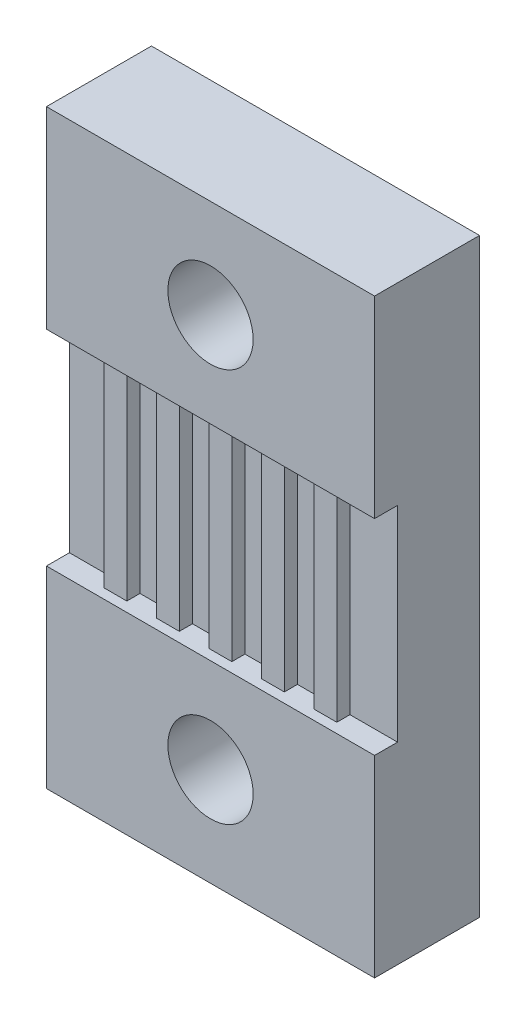
ISO-10303-21;
HEADER;
FILE_DESCRIPTION(('STEP AP214'),'2;1');
FILE_NAME('part.step','',(''),(''),'','','');
FILE_SCHEMA(('AUTOMOTIVE_DESIGN { 1 0 10303 214 1 1 1 1 }'));
ENDSEC;
DATA;
#1=APPLICATION_CONTEXT('core data for automotive mechanical design processes');
#2=APPLICATION_PROTOCOL_DEFINITION('international standard','automotive_design',2000,#1);
#3=PRODUCT_CONTEXT('',#1,'mechanical');
#4=PRODUCT('Part','Part','',(#3));
#5=PRODUCT_RELATED_PRODUCT_CATEGORY('part','',(#4));
#6=PRODUCT_DEFINITION_FORMATION('','',#4);
#7=PRODUCT_DEFINITION_CONTEXT('part definition',#1,'design');
#8=PRODUCT_DEFINITION('design','',#6,#7);
#9=PRODUCT_DEFINITION_SHAPE('','',#8);
#10=(LENGTH_UNIT() NAMED_UNIT(*) SI_UNIT(.MILLI.,.METRE.));
#11=(NAMED_UNIT(*) PLANE_ANGLE_UNIT() SI_UNIT($,.RADIAN.));
#12=(NAMED_UNIT(*) SI_UNIT($,.STERADIAN.) SOLID_ANGLE_UNIT());
#13=UNCERTAINTY_MEASURE_WITH_UNIT(LENGTH_MEASURE(1.E-05),#10,'distance_accuracy_value','');
#14=(GEOMETRIC_REPRESENTATION_CONTEXT(3) GLOBAL_UNCERTAINTY_ASSIGNED_CONTEXT((#13)) GLOBAL_UNIT_ASSIGNED_CONTEXT((#10,
#11,#12)) REPRESENTATION_CONTEXT('',''));
#15=CARTESIAN_POINT('',(0.,0.,0.));
#16=DIRECTION('',(0.,0.,1.));
#17=DIRECTION('',(1.,0.,0.));
#18=AXIS2_PLACEMENT_3D('',#15,#16,#17);
#19=CARTESIAN_POINT('',(0.,0.,3.175));
#20=DIRECTION('',(0.,0.,-1.));
#21=DIRECTION('',(-1.,0.,0.));
#22=AXIS2_PLACEMENT_3D('',#19,#20,#21);
#23=PLANE('',#22);
#24=DIRECTION('',(0.,1.,0.));
#25=VECTOR('',#24,1.);
#26=CARTESIAN_POINT('',(-4.5085,-11.432,3.175));
#27=LINE('',#26,#25);
#28=CARTESIAN_POINT('',(-4.5085,-3.96875,3.175));
#29=VERTEX_POINT('',#28);
#30=CARTESIAN_POINT('',(-4.5085,3.96875,3.175));
#31=VERTEX_POINT('',#30);
#32=EDGE_CURVE('E246',#29,#31,#27,.T.);
#33=ORIENTED_EDGE('',*,*,#32,.T.);
#34=DIRECTION('',(1.,0.,0.));
#35=VECTOR('',#34,1.);
#36=CARTESIAN_POINT('',(-6.35,3.96875,3.175));
#37=LINE('',#36,#35);
#38=CARTESIAN_POINT('',(-6.35,3.96875,3.175));
#39=VERTEX_POINT('',#38);
#40=EDGE_CURVE('E234',#39,#31,#37,.T.);
#41=ORIENTED_EDGE('',*,*,#40,.F.);
#42=DIRECTION('',(0.,-1.,0.));
#43=VECTOR('',#42,1.);
#44=CARTESIAN_POINT('',(-6.35,-11.43,3.175));
#45=LINE('',#44,#43);
#46=CARTESIAN_POINT('',(-6.35,-3.96875,3.175));
#47=VERTEX_POINT('',#46);
#48=EDGE_CURVE('E427',#39,#47,#45,.T.);
#49=ORIENTED_EDGE('',*,*,#48,.T.);
#50=DIRECTION('',(-1.,0.,0.));
#51=VECTOR('',#50,1.);
#52=CARTESIAN_POINT('',(-6.35,-3.96875,3.175));
#53=LINE('',#52,#51);
#54=EDGE_CURVE('E415',#29,#47,#53,.T.);
#55=ORIENTED_EDGE('',*,*,#54,.F.);
#56=EDGE_LOOP('',(#33,#41,#49,#55));
#57=FACE_BOUND('',#56,.T.);
#58=ADVANCED_FACE('F43',(#57),#23,.F.);
#59=DIRECTION('',(0.,1.,0.));
#60=VECTOR('',#59,1.);
#61=CARTESIAN_POINT('',(-3.6195,-11.432,3.175));
#62=LINE('',#61,#60);
#63=CARTESIAN_POINT('',(-3.6195,-3.96875,3.175));
#64=VERTEX_POINT('',#63);
#65=CARTESIAN_POINT('',(-3.6195,3.96875,3.175));
#66=VERTEX_POINT('',#65);
#67=EDGE_CURVE('E252',#64,#66,#62,.T.);
#68=ORIENTED_EDGE('',*,*,#67,.F.);
#69=CARTESIAN_POINT('',(-2.4765,-3.96875,3.175));
#70=VERTEX_POINT('',#69);
#71=EDGE_CURVE('E473',#70,#64,#53,.T.);
#72=ORIENTED_EDGE('',*,*,#71,.F.);
#73=DIRECTION('',(0.,1.,0.));
#74=VECTOR('',#73,1.);
#75=CARTESIAN_POINT('',(-2.4765,-11.432,3.175));
#76=LINE('',#75,#74);
#77=CARTESIAN_POINT('',(-2.4765,3.96875,3.175));
#78=VERTEX_POINT('',#77);
#79=EDGE_CURVE('E326',#70,#78,#76,.T.);
#80=ORIENTED_EDGE('',*,*,#79,.T.);
#81=EDGE_CURVE('E387',#66,#78,#37,.T.);
#82=ORIENTED_EDGE('',*,*,#81,.F.);
#83=EDGE_LOOP('',(#68,#72,#80,#82));
#84=FACE_BOUND('',#83,.T.);
#85=ADVANCED_FACE('F475',(#84),#23,.F.);
#86=DIRECTION('',(0.,1.,0.));
#87=VECTOR('',#86,1.);
#88=CARTESIAN_POINT('',(-1.5875,-11.432,3.175));
#89=LINE('',#88,#87);
#90=CARTESIAN_POINT('',(-1.5875,-3.96875,3.175));
#91=VERTEX_POINT('',#90);
#92=CARTESIAN_POINT('',(-1.5875,3.96875,3.175));
#93=VERTEX_POINT('',#92);
#94=EDGE_CURVE('E325',#91,#93,#89,.T.);
#95=ORIENTED_EDGE('',*,*,#94,.F.);
#96=CARTESIAN_POINT('',(-0.444500000000001,-3.96875,3.175));
#97=VERTEX_POINT('',#96);
#98=EDGE_CURVE('E405',#97,#91,#53,.T.);
#99=ORIENTED_EDGE('',*,*,#98,.F.);
#100=DIRECTION('',(0.,1.,0.));
#101=VECTOR('',#100,1.);
#102=CARTESIAN_POINT('',(-0.4445,-11.432,3.175));
#103=LINE('',#102,#101);
#104=CARTESIAN_POINT('',(-0.444500000000001,3.96875,3.175));
#105=VERTEX_POINT('',#104);
#106=EDGE_CURVE('E361',#97,#105,#103,.T.);
#107=ORIENTED_EDGE('',*,*,#106,.T.);
#108=EDGE_CURVE('E388',#93,#105,#37,.T.);
#109=ORIENTED_EDGE('',*,*,#108,.F.);
#110=EDGE_LOOP('',(#95,#99,#107,#109));
#111=FACE_BOUND('',#110,.T.);
#112=ADVANCED_FACE('F482',(#111),#23,.F.);
#113=DIRECTION('',(0.,1.,0.));
#114=VECTOR('',#113,1.);
#115=CARTESIAN_POINT('',(3.6195,-11.432,3.175));
#116=LINE('',#115,#114);
#117=CARTESIAN_POINT('',(3.6195,-3.96875,3.175));
#118=VERTEX_POINT('',#117);
#119=CARTESIAN_POINT('',(3.6195,3.96875,3.175));
#120=VERTEX_POINT('',#119);
#121=EDGE_CURVE('E307',#118,#120,#116,.T.);
#122=ORIENTED_EDGE('',*,*,#121,.T.);
#123=CARTESIAN_POINT('',(2.4765,3.96875,3.175));
#124=VERTEX_POINT('',#123);
#125=EDGE_CURVE('E503',#124,#120,#37,.T.);
#126=ORIENTED_EDGE('',*,*,#125,.F.);
#127=DIRECTION('',(0.,1.,0.));
#128=VECTOR('',#127,1.);
#129=CARTESIAN_POINT('',(2.4765,-11.432,3.175));
#130=LINE('',#129,#128);
#131=CARTESIAN_POINT('',(2.4765,-3.96875,3.175));
#132=VERTEX_POINT('',#131);
#133=EDGE_CURVE('E274',#132,#124,#130,.T.);
#134=ORIENTED_EDGE('',*,*,#133,.F.);
#135=EDGE_CURVE('E403',#118,#132,#53,.T.);
#136=ORIENTED_EDGE('',*,*,#135,.F.);
#137=EDGE_LOOP('',(#122,#126,#134,#136));
#138=FACE_BOUND('',#137,.T.);
#139=ADVANCED_FACE('F494',(#138),#23,.F.);
#140=DIRECTION('',(0.,1.,0.));
#141=VECTOR('',#140,1.);
#142=CARTESIAN_POINT('',(4.5085,-11.432,3.175));
#143=LINE('',#142,#141);
#144=CARTESIAN_POINT('',(4.5085,-3.96875,3.175));
#145=VERTEX_POINT('',#144);
#146=CARTESIAN_POINT('',(4.5085,3.96875,3.175));
#147=VERTEX_POINT('',#146);
#148=EDGE_CURVE('E300',#145,#147,#143,.T.);
#149=ORIENTED_EDGE('',*,*,#148,.F.);
#150=CARTESIAN_POINT('',(6.35,-3.96875,3.175));
#151=VERTEX_POINT('',#150);
#152=EDGE_CURVE('E401',#151,#145,#53,.T.);
#153=ORIENTED_EDGE('',*,*,#152,.F.);
#154=DIRECTION('',(0.,1.,0.));
#155=VECTOR('',#154,1.);
#156=CARTESIAN_POINT('',(6.35,-11.43,3.175));
#157=LINE('',#156,#155);
#158=CARTESIAN_POINT('',(6.35,3.96875,3.175));
#159=VERTEX_POINT('',#158);
#160=EDGE_CURVE('E424',#151,#159,#157,.T.);
#161=ORIENTED_EDGE('',*,*,#160,.T.);
#162=EDGE_CURVE('E372',#147,#159,#37,.T.);
#163=ORIENTED_EDGE('',*,*,#162,.F.);
#164=EDGE_LOOP('',(#149,#153,#161,#163));
#165=FACE_BOUND('',#164,.T.);
#166=ADVANCED_FACE('F487',(#165),#23,.F.);
#167=DIRECTION('',(0.,1.,0.));
#168=VECTOR('',#167,1.);
#169=CARTESIAN_POINT('',(1.5875,-11.432,3.175));
#170=LINE('',#169,#168);
#171=CARTESIAN_POINT('',(1.5875,-3.96875,3.175));
#172=VERTEX_POINT('',#171);
#173=CARTESIAN_POINT('',(1.5875,3.96875,3.175));
#174=VERTEX_POINT('',#173);
#175=EDGE_CURVE('E277',#172,#174,#170,.T.);
#176=ORIENTED_EDGE('',*,*,#175,.T.);
#177=CARTESIAN_POINT('',(0.444499999999999,3.96875,3.175));
#178=VERTEX_POINT('',#177);
#179=EDGE_CURVE('E389',#178,#174,#37,.T.);
#180=ORIENTED_EDGE('',*,*,#179,.F.);
#181=DIRECTION('',(0.,1.,0.));
#182=VECTOR('',#181,1.);
#183=CARTESIAN_POINT('',(0.4445,-11.432,3.175));
#184=LINE('',#183,#182);
#185=CARTESIAN_POINT('',(0.444499999999999,-3.96875,3.175));
#186=VERTEX_POINT('',#185);
#187=EDGE_CURVE('E352',#186,#178,#184,.T.);
#188=ORIENTED_EDGE('',*,*,#187,.F.);
#189=EDGE_CURVE('E404',#172,#186,#53,.T.);
#190=ORIENTED_EDGE('',*,*,#189,.F.);
#191=EDGE_LOOP('',(#176,#180,#188,#190));
#192=FACE_BOUND('',#191,.T.);
#193=ADVANCED_FACE('F477',(#192),#23,.F.);
#194=CARTESIAN_POINT('',(-6.35,-3.96875,4.064));
#195=DIRECTION('',(0.,-1.,0.));
#196=DIRECTION('',(0.,0.,-1.));
#197=AXIS2_PLACEMENT_3D('',#194,#195,#196);
#198=PLANE('',#197);
#199=DIRECTION('',(0.,0.,-1.));
#200=VECTOR('',#199,1.);
#201=CARTESIAN_POINT('',(3.6195,-3.96875,3.175));
#202=LINE('',#201,#200);
#203=CARTESIAN_POINT('',(3.6195,-3.96875,3.683));
#204=VERTEX_POINT('',#203);
#205=EDGE_CURVE('E313',#204,#118,#202,.T.);
#206=ORIENTED_EDGE('',*,*,#205,.T.);
#207=ORIENTED_EDGE('',*,*,#135,.T.);
#208=DIRECTION('',(0.,0.,1.));
#209=VECTOR('',#208,1.);
#210=CARTESIAN_POINT('',(2.4765,-3.96875,3.683));
#211=LINE('',#210,#209);
#212=CARTESIAN_POINT('',(2.4765,-3.96875,3.683));
#213=VERTEX_POINT('',#212);
#214=EDGE_CURVE('E282',#132,#213,#211,.T.);
#215=ORIENTED_EDGE('',*,*,#214,.T.);
#216=DIRECTION('',(-1.,0.,0.));
#217=VECTOR('',#216,1.);
#218=CARTESIAN_POINT('',(1.5875,-3.96875,3.683));
#219=LINE('',#218,#217);
#220=CARTESIAN_POINT('',(1.5875,-3.96875,3.683));
#221=VERTEX_POINT('',#220);
#222=EDGE_CURVE('E287',#213,#221,#219,.T.);
#223=ORIENTED_EDGE('',*,*,#222,.T.);
#224=DIRECTION('',(0.,0.,-1.));
#225=VECTOR('',#224,1.);
#226=CARTESIAN_POINT('',(1.5875,-3.96875,3.175));
#227=LINE('',#226,#225);
#228=EDGE_CURVE('E289',#221,#172,#227,.T.);
#229=ORIENTED_EDGE('',*,*,#228,.T.);
#230=ORIENTED_EDGE('',*,*,#189,.T.);
#231=DIRECTION('',(0.,0.,1.));
#232=VECTOR('',#231,1.);
#233=CARTESIAN_POINT('',(0.4445,-3.96875,3.683));
#234=LINE('',#233,#232);
#235=CARTESIAN_POINT('',(0.4445,-3.96875,3.683));
#236=VERTEX_POINT('',#235);
#237=EDGE_CURVE('E353',#186,#236,#234,.T.);
#238=ORIENTED_EDGE('',*,*,#237,.T.);
#239=DIRECTION('',(-1.,0.,0.));
#240=VECTOR('',#239,1.);
#241=CARTESIAN_POINT('',(-0.4445,-3.96875,3.683));
#242=LINE('',#241,#240);
#243=CARTESIAN_POINT('',(-0.4445,-3.96875,3.683));
#244=VERTEX_POINT('',#243);
#245=EDGE_CURVE('E356',#236,#244,#242,.T.);
#246=ORIENTED_EDGE('',*,*,#245,.T.);
#247=DIRECTION('',(0.,0.,-1.));
#248=VECTOR('',#247,1.);
#249=CARTESIAN_POINT('',(-0.4445,-3.96875,3.175));
#250=LINE('',#249,#248);
#251=EDGE_CURVE('E318',#244,#97,#250,.T.);
#252=ORIENTED_EDGE('',*,*,#251,.T.);
#253=ORIENTED_EDGE('',*,*,#98,.T.);
#254=DIRECTION('',(0.,0.,1.));
#255=VECTOR('',#254,1.);
#256=CARTESIAN_POINT('',(-1.5875,-3.96875,3.683));
#257=LINE('',#256,#255);
#258=CARTESIAN_POINT('',(-1.5875,-3.96875,3.683));
#259=VERTEX_POINT('',#258);
#260=EDGE_CURVE('E336',#91,#259,#257,.T.);
#261=ORIENTED_EDGE('',*,*,#260,.T.);
#262=DIRECTION('',(-1.,0.,0.));
#263=VECTOR('',#262,1.);
#264=CARTESIAN_POINT('',(-2.4765,-3.96875,3.683));
#265=LINE('',#264,#263);
#266=CARTESIAN_POINT('',(-2.4765,-3.96875,3.683));
#267=VERTEX_POINT('',#266);
#268=EDGE_CURVE('E338',#259,#267,#265,.T.);
#269=ORIENTED_EDGE('',*,*,#268,.T.);
#270=DIRECTION('',(0.,0.,-1.));
#271=VECTOR('',#270,1.);
#272=CARTESIAN_POINT('',(-2.4765,-3.96875,3.175));
#273=LINE('',#272,#271);
#274=EDGE_CURVE('E340',#267,#70,#273,.T.);
#275=ORIENTED_EDGE('',*,*,#274,.T.);
#276=ORIENTED_EDGE('',*,*,#71,.T.);
#277=DIRECTION('',(0.,0.,1.));
#278=VECTOR('',#277,1.);
#279=CARTESIAN_POINT('',(-3.6195,-3.96875,3.683));
#280=LINE('',#279,#278);
#281=CARTESIAN_POINT('',(-3.6195,-3.96875,3.683));
#282=VERTEX_POINT('',#281);
#283=EDGE_CURVE('E258',#64,#282,#280,.T.);
#284=ORIENTED_EDGE('',*,*,#283,.T.);
#285=DIRECTION('',(-1.,0.,0.));
#286=VECTOR('',#285,1.);
#287=CARTESIAN_POINT('',(-4.5085,-3.96875,3.683));
#288=LINE('',#287,#286);
#289=CARTESIAN_POINT('',(-4.5085,-3.96875,3.683));
#290=VERTEX_POINT('',#289);
#291=EDGE_CURVE('E262',#282,#290,#288,.T.);
#292=ORIENTED_EDGE('',*,*,#291,.T.);
#293=DIRECTION('',(0.,0.,-1.));
#294=VECTOR('',#293,1.);
#295=CARTESIAN_POINT('',(-4.5085,-3.96875,3.175));
#296=LINE('',#295,#294);
#297=EDGE_CURVE('E243',#290,#29,#296,.T.);
#298=ORIENTED_EDGE('',*,*,#297,.T.);
#299=ORIENTED_EDGE('',*,*,#54,.T.);
#300=DIRECTION('',(0.,0.,-1.));
#301=VECTOR('',#300,1.);
#302=CARTESIAN_POINT('',(-6.35,-3.96875,4.064));
#303=LINE('',#302,#301);
#304=CARTESIAN_POINT('',(-6.35,-3.96875,4.064));
#305=VERTEX_POINT('',#304);
#306=EDGE_CURVE('E397',#305,#47,#303,.T.);
#307=ORIENTED_EDGE('',*,*,#306,.F.);
#308=DIRECTION('',(-1.,0.,0.));
#309=VECTOR('',#308,1.);
#310=CARTESIAN_POINT('',(-6.35,-3.96875,4.064));
#311=LINE('',#310,#309);
#312=CARTESIAN_POINT('',(6.35,-3.96875,4.064));
#313=VERTEX_POINT('',#312);
#314=EDGE_CURVE('E400',#313,#305,#311,.T.);
#315=ORIENTED_EDGE('',*,*,#314,.F.);
#316=DIRECTION('',(0.,0.,-1.));
#317=VECTOR('',#316,1.);
#318=CARTESIAN_POINT('',(6.35,-3.96875,4.064));
#319=LINE('',#318,#317);
#320=EDGE_CURVE('E345',#313,#151,#319,.T.);
#321=ORIENTED_EDGE('',*,*,#320,.T.);
#322=ORIENTED_EDGE('',*,*,#152,.T.);
#323=DIRECTION('',(0.,0.,1.));
#324=VECTOR('',#323,1.);
#325=CARTESIAN_POINT('',(4.5085,-3.96875,3.683));
#326=LINE('',#325,#324);
#327=CARTESIAN_POINT('',(4.5085,-3.96875,3.683));
#328=VERTEX_POINT('',#327);
#329=EDGE_CURVE('E58',#145,#328,#326,.T.);
#330=ORIENTED_EDGE('',*,*,#329,.T.);
#331=DIRECTION('',(-1.,0.,0.));
#332=VECTOR('',#331,1.);
#333=CARTESIAN_POINT('',(3.6195,-3.96875,3.683));
#334=LINE('',#333,#332);
#335=EDGE_CURVE('E62',#328,#204,#334,.T.);
#336=ORIENTED_EDGE('',*,*,#335,.T.);
#337=EDGE_LOOP('',(#206,#207,#215,#223,#229,#230,#238,#246,#252,#253,#261,#269,#275,#276,#284,
#292,#298,#299,#307,#315,#321,#322,#330,#336));
#338=FACE_BOUND('',#337,.T.);
#339=ADVANCED_FACE('F470',(#338),#198,.F.);
#340=CARTESIAN_POINT('',(-6.35,3.96875,4.064));
#341=DIRECTION('',(0.,1.,0.));
#342=DIRECTION('',(0.,0.,1.));
#343=AXIS2_PLACEMENT_3D('',#340,#341,#342);
#344=PLANE('',#343);
#345=DIRECTION('',(0.,0.,-1.));
#346=VECTOR('',#345,1.);
#347=CARTESIAN_POINT('',(3.6195,3.96875,3.175));
#348=LINE('',#347,#346);
#349=CARTESIAN_POINT('',(3.6195,3.96875,3.683));
#350=VERTEX_POINT('',#349);
#351=EDGE_CURVE('E294',#350,#120,#348,.T.);
#352=ORIENTED_EDGE('',*,*,#351,.F.);
#353=DIRECTION('',(-1.,0.,0.));
#354=VECTOR('',#353,1.);
#355=CARTESIAN_POINT('',(3.6195,3.96875,3.683));
#356=LINE('',#355,#354);
#357=CARTESIAN_POINT('',(4.5085,3.96875,3.683));
#358=VERTEX_POINT('',#357);
#359=EDGE_CURVE('E297',#358,#350,#356,.T.);
#360=ORIENTED_EDGE('',*,*,#359,.F.);
#361=DIRECTION('',(0.,0.,1.));
#362=VECTOR('',#361,1.);
#363=CARTESIAN_POINT('',(4.5085,3.96875,3.683));
#364=LINE('',#363,#362);
#365=EDGE_CURVE('E291',#147,#358,#364,.T.);
#366=ORIENTED_EDGE('',*,*,#365,.F.);
#367=ORIENTED_EDGE('',*,*,#162,.T.);
#368=DIRECTION('',(0.,0.,-1.));
#369=VECTOR('',#368,1.);
#370=CARTESIAN_POINT('',(6.35,3.96875,4.064));
#371=LINE('',#370,#369);
#372=CARTESIAN_POINT('',(6.35,3.96875,4.064));
#373=VERTEX_POINT('',#372);
#374=EDGE_CURVE('E385',#373,#159,#371,.T.);
#375=ORIENTED_EDGE('',*,*,#374,.F.);
#376=DIRECTION('',(1.,0.,0.));
#377=VECTOR('',#376,1.);
#378=CARTESIAN_POINT('',(-6.35,3.96875,4.064));
#379=LINE('',#378,#377);
#380=CARTESIAN_POINT('',(-6.35,3.96875,4.064));
#381=VERTEX_POINT('',#380);
#382=EDGE_CURVE('E377',#381,#373,#379,.T.);
#383=ORIENTED_EDGE('',*,*,#382,.F.);
#384=DIRECTION('',(0.,0.,-1.));
#385=VECTOR('',#384,1.);
#386=CARTESIAN_POINT('',(-6.35,3.96875,4.064));
#387=LINE('',#386,#385);
#388=EDGE_CURVE('E392',#381,#39,#387,.T.);
#389=ORIENTED_EDGE('',*,*,#388,.T.);
#390=ORIENTED_EDGE('',*,*,#40,.T.);
#391=DIRECTION('',(0.,0.,-1.));
#392=VECTOR('',#391,1.);
#393=CARTESIAN_POINT('',(-4.5085,3.96875,3.175));
#394=LINE('',#393,#392);
#395=CARTESIAN_POINT('',(-4.5085,3.96875,3.683));
#396=VERTEX_POINT('',#395);
#397=EDGE_CURVE('E227',#396,#31,#394,.T.);
#398=ORIENTED_EDGE('',*,*,#397,.F.);
#399=DIRECTION('',(-1.,0.,0.));
#400=VECTOR('',#399,1.);
#401=CARTESIAN_POINT('',(-4.5085,3.96875,3.683));
#402=LINE('',#401,#400);
#403=CARTESIAN_POINT('',(-3.6195,3.96875,3.683));
#404=VERTEX_POINT('',#403);
#405=EDGE_CURVE('E231',#404,#396,#402,.T.);
#406=ORIENTED_EDGE('',*,*,#405,.F.);
#407=DIRECTION('',(0.,0.,1.));
#408=VECTOR('',#407,1.);
#409=CARTESIAN_POINT('',(-3.6195,3.96875,3.683));
#410=LINE('',#409,#408);
#411=EDGE_CURVE('E237',#66,#404,#410,.T.);
#412=ORIENTED_EDGE('',*,*,#411,.F.);
#413=ORIENTED_EDGE('',*,*,#81,.T.);
#414=DIRECTION('',(0.,0.,-1.));
#415=VECTOR('',#414,1.);
#416=CARTESIAN_POINT('',(-2.4765,3.96875,3.175));
#417=LINE('',#416,#415);
#418=CARTESIAN_POINT('',(-2.4765,3.96875,3.683));
#419=VERTEX_POINT('',#418);
#420=EDGE_CURVE('E319',#419,#78,#417,.T.);
#421=ORIENTED_EDGE('',*,*,#420,.F.);
#422=DIRECTION('',(-1.,0.,0.));
#423=VECTOR('',#422,1.);
#424=CARTESIAN_POINT('',(-2.4765,3.96875,3.683));
#425=LINE('',#424,#423);
#426=CARTESIAN_POINT('',(-1.5875,3.96875,3.683));
#427=VERTEX_POINT('',#426);
#428=EDGE_CURVE('E322',#427,#419,#425,.T.);
#429=ORIENTED_EDGE('',*,*,#428,.F.);
#430=DIRECTION('',(0.,0.,1.));
#431=VECTOR('',#430,1.);
#432=CARTESIAN_POINT('',(-1.5875,3.96875,3.683));
#433=LINE('',#432,#431);
#434=EDGE_CURVE('E315',#93,#427,#433,.T.);
#435=ORIENTED_EDGE('',*,*,#434,.F.);
#436=ORIENTED_EDGE('',*,*,#108,.T.);
#437=DIRECTION('',(0.,0.,-1.));
#438=VECTOR('',#437,1.);
#439=CARTESIAN_POINT('',(-0.4445,3.96875,3.175));
#440=LINE('',#439,#438);
#441=CARTESIAN_POINT('',(-0.4445,3.96875,3.683));
#442=VERTEX_POINT('',#441);
#443=EDGE_CURVE('E346',#442,#105,#440,.T.);
#444=ORIENTED_EDGE('',*,*,#443,.F.);
#445=DIRECTION('',(-1.,0.,0.));
#446=VECTOR('',#445,1.);
#447=CARTESIAN_POINT('',(-0.4445,3.96875,3.683));
#448=LINE('',#447,#446);
#449=CARTESIAN_POINT('',(0.4445,3.96875,3.683));
#450=VERTEX_POINT('',#449);
#451=EDGE_CURVE('E349',#450,#442,#448,.T.);
#452=ORIENTED_EDGE('',*,*,#451,.F.);
#453=DIRECTION('',(0.,0.,1.));
#454=VECTOR('',#453,1.);
#455=CARTESIAN_POINT('',(0.4445,3.96875,3.683));
#456=LINE('',#455,#454);
#457=EDGE_CURVE('E342',#178,#450,#456,.T.);
#458=ORIENTED_EDGE('',*,*,#457,.F.);
#459=ORIENTED_EDGE('',*,*,#179,.T.);
#460=DIRECTION('',(0.,0.,-1.));
#461=VECTOR('',#460,1.);
#462=CARTESIAN_POINT('',(1.5875,3.96875,3.175));
#463=LINE('',#462,#461);
#464=CARTESIAN_POINT('',(1.5875,3.96875,3.683));
#465=VERTEX_POINT('',#464);
#466=EDGE_CURVE('E268',#465,#174,#463,.T.);
#467=ORIENTED_EDGE('',*,*,#466,.F.);
#468=DIRECTION('',(-1.,0.,0.));
#469=VECTOR('',#468,1.);
#470=CARTESIAN_POINT('',(1.5875,3.96875,3.683));
#471=LINE('',#470,#469);
#472=CARTESIAN_POINT('',(2.4765,3.96875,3.683));
#473=VERTEX_POINT('',#472);
#474=EDGE_CURVE('E271',#473,#465,#471,.T.);
#475=ORIENTED_EDGE('',*,*,#474,.F.);
#476=DIRECTION('',(0.,0.,1.));
#477=VECTOR('',#476,1.);
#478=CARTESIAN_POINT('',(2.4765,3.96875,3.683));
#479=LINE('',#478,#477);
#480=EDGE_CURVE('E265',#124,#473,#479,.T.);
#481=ORIENTED_EDGE('',*,*,#480,.F.);
#482=ORIENTED_EDGE('',*,*,#125,.T.);
#483=EDGE_LOOP('',(#352,#360,#366,#367,#375,#383,#389,#390,#398,#406,#412,#413,#421,#429,#435,
#436,#444,#452,#458,#459,#467,#475,#481,#482));
#484=FACE_BOUND('',#483,.T.);
#485=ADVANCED_FACE('F229',(#484),#344,.F.);
#486=CARTESIAN_POINT('',(0.,0.,0.));
#487=DIRECTION('',(0.,0.,-1.));
#488=DIRECTION('',(-1.,0.,0.));
#489=AXIS2_PLACEMENT_3D('',#486,#487,#488);
#490=PLANE('',#489);
#491=CARTESIAN_POINT('',(0.,7.62,0.));
#492=DIRECTION('',(0.,0.,1.));
#493=DIRECTION('',(1.,0.,0.));
#494=AXIS2_PLACEMENT_3D('',#491,#492,#493);
#495=CIRCLE('',#494,1.65);
#496=CARTESIAN_POINT('',(1.65,7.62,0.));
#497=VERTEX_POINT('',#496);
#498=EDGE_CURVE('E420',#497,#497,#495,.T.);
#499=ORIENTED_EDGE('',*,*,#498,.T.);
#500=EDGE_LOOP('',(#499));
#501=FACE_BOUND('',#500,.T.);
#502=DIRECTION('',(0.,1.,0.));
#503=VECTOR('',#502,1.);
#504=CARTESIAN_POINT('',(6.35,-11.43,0.));
#505=LINE('',#504,#503);
#506=CARTESIAN_POINT('',(6.35,-11.43,0.));
#507=VERTEX_POINT('',#506);
#508=CARTESIAN_POINT('',(6.35,11.43,0.));
#509=VERTEX_POINT('',#508);
#510=EDGE_CURVE('E423',#507,#509,#505,.T.);
#511=ORIENTED_EDGE('',*,*,#510,.F.);
#512=DIRECTION('',(1.,0.,0.));
#513=VECTOR('',#512,1.);
#514=CARTESIAN_POINT('',(-6.35,-11.43,0.));
#515=LINE('',#514,#513);
#516=CARTESIAN_POINT('',(-6.35,-11.43,0.));
#517=VERTEX_POINT('',#516);
#518=EDGE_CURVE('E428',#517,#507,#515,.T.);
#519=ORIENTED_EDGE('',*,*,#518,.F.);
#520=DIRECTION('',(0.,-1.,0.));
#521=VECTOR('',#520,1.);
#522=CARTESIAN_POINT('',(-6.35,-11.43,0.));
#523=LINE('',#522,#521);
#524=CARTESIAN_POINT('',(-6.35,11.43,0.));
#525=VERTEX_POINT('',#524);
#526=EDGE_CURVE('E436',#525,#517,#523,.T.);
#527=ORIENTED_EDGE('',*,*,#526,.F.);
#528=DIRECTION('',(-1.,0.,0.));
#529=VECTOR('',#528,1.);
#530=CARTESIAN_POINT('',(-6.35,11.43,0.));
#531=LINE('',#530,#529);
#532=EDGE_CURVE('E434',#509,#525,#531,.T.);
#533=ORIENTED_EDGE('',*,*,#532,.F.);
#534=EDGE_LOOP('',(#511,#519,#527,#533));
#535=FACE_BOUND('',#534,.T.);
#536=CARTESIAN_POINT('',(0.,-7.62,0.));
#537=DIRECTION('',(0.,0.,1.));
#538=DIRECTION('',(-1.,0.,0.));
#539=AXIS2_PLACEMENT_3D('',#536,#537,#538);
#540=CIRCLE('',#539,1.65);
#541=CARTESIAN_POINT('',(-1.65,-7.62,0.));
#542=VERTEX_POINT('',#541);
#543=EDGE_CURVE('E394',#542,#542,#540,.T.);
#544=ORIENTED_EDGE('',*,*,#543,.T.);
#545=EDGE_LOOP('',(#544));
#546=FACE_BOUND('',#545,.T.);
#547=ADVANCED_FACE('F454',(#501,#535,#546),#490,.T.);
#548=CARTESIAN_POINT('',(6.35,-11.43,3.175));
#549=DIRECTION('',(-1.,0.,0.));
#550=DIRECTION('',(0.,0.,1.));
#551=AXIS2_PLACEMENT_3D('',#548,#549,#550);
#552=PLANE('',#551);
#553=ORIENTED_EDGE('',*,*,#510,.T.);
#554=DIRECTION('',(0.,0.,-1.));
#555=VECTOR('',#554,1.);
#556=CARTESIAN_POINT('',(6.35,11.43,3.175));
#557=LINE('',#556,#555);
#558=CARTESIAN_POINT('',(6.35,11.43,4.064));
#559=VERTEX_POINT('',#558);
#560=EDGE_CURVE('E11',#559,#509,#557,.T.);
#561=ORIENTED_EDGE('',*,*,#560,.F.);
#562=DIRECTION('',(0.,1.,0.));
#563=VECTOR('',#562,1.);
#564=CARTESIAN_POINT('',(6.35,11.43,4.064));
#565=LINE('',#564,#563);
#566=EDGE_CURVE('E379',#373,#559,#565,.T.);
#567=ORIENTED_EDGE('',*,*,#566,.F.);
#568=ORIENTED_EDGE('',*,*,#374,.T.);
#569=ORIENTED_EDGE('',*,*,#160,.F.);
#570=ORIENTED_EDGE('',*,*,#320,.F.);
#571=DIRECTION('',(0.,1.,0.));
#572=VECTOR('',#571,1.);
#573=CARTESIAN_POINT('',(6.35,-11.43,4.064));
#574=LINE('',#573,#572);
#575=CARTESIAN_POINT('',(6.35,-11.43,4.064));
#576=VERTEX_POINT('',#575);
#577=EDGE_CURVE('E407',#576,#313,#574,.T.);
#578=ORIENTED_EDGE('',*,*,#577,.F.);
#579=DIRECTION('',(0.,0.,-1.));
#580=VECTOR('',#579,1.);
#581=CARTESIAN_POINT('',(6.35,-11.43,3.175));
#582=LINE('',#581,#580);
#583=EDGE_CURVE('E431',#576,#507,#582,.T.);
#584=ORIENTED_EDGE('',*,*,#583,.T.);
#585=EDGE_LOOP('',(#553,#561,#567,#568,#569,#570,#578,#584));
#586=FACE_BOUND('',#585,.T.);
#587=ADVANCED_FACE('F45',(#586),#552,.F.);
#588=CARTESIAN_POINT('',(-6.35,11.43,3.175));
#589=DIRECTION('',(0.,-1.,0.));
#590=DIRECTION('',(0.,0.,-1.));
#591=AXIS2_PLACEMENT_3D('',#588,#589,#590);
#592=PLANE('',#591);
#593=ORIENTED_EDGE('',*,*,#532,.T.);
#594=DIRECTION('',(0.,0.,-1.));
#595=VECTOR('',#594,1.);
#596=CARTESIAN_POINT('',(-6.35,11.43,3.175));
#597=LINE('',#596,#595);
#598=CARTESIAN_POINT('',(-6.35,11.43,4.064));
#599=VERTEX_POINT('',#598);
#600=EDGE_CURVE('E51',#599,#525,#597,.T.);
#601=ORIENTED_EDGE('',*,*,#600,.F.);
#602=DIRECTION('',(-1.,0.,0.));
#603=VECTOR('',#602,1.);
#604=CARTESIAN_POINT('',(-6.35,11.43,4.064));
#605=LINE('',#604,#603);
#606=EDGE_CURVE('E382',#559,#599,#605,.T.);
#607=ORIENTED_EDGE('',*,*,#606,.F.);
#608=ORIENTED_EDGE('',*,*,#560,.T.);
#609=EDGE_LOOP('',(#593,#601,#607,#608));
#610=FACE_BOUND('',#609,.T.);
#611=ADVANCED_FACE('F537',(#610),#592,.F.);
#612=CARTESIAN_POINT('',(-6.35,-11.43,3.175));
#613=DIRECTION('',(1.,0.,0.));
#614=DIRECTION('',(0.,0.,-1.));
#615=AXIS2_PLACEMENT_3D('',#612,#613,#614);
#616=PLANE('',#615);
#617=ORIENTED_EDGE('',*,*,#526,.T.);
#618=DIRECTION('',(0.,0.,-1.));
#619=VECTOR('',#618,1.);
#620=CARTESIAN_POINT('',(-6.35,-11.43,3.175));
#621=LINE('',#620,#619);
#622=CARTESIAN_POINT('',(-6.35,-11.43,4.064));
#623=VERTEX_POINT('',#622);
#624=EDGE_CURVE('E441',#623,#517,#621,.T.);
#625=ORIENTED_EDGE('',*,*,#624,.F.);
#626=DIRECTION('',(0.,-1.,0.));
#627=VECTOR('',#626,1.);
#628=CARTESIAN_POINT('',(-6.35,-11.43,4.064));
#629=LINE('',#628,#627);
#630=EDGE_CURVE('E412',#305,#623,#629,.T.);
#631=ORIENTED_EDGE('',*,*,#630,.F.);
#632=ORIENTED_EDGE('',*,*,#306,.T.);
#633=ORIENTED_EDGE('',*,*,#48,.F.);
#634=ORIENTED_EDGE('',*,*,#388,.F.);
#635=DIRECTION('',(0.,-1.,0.));
#636=VECTOR('',#635,1.);
#637=CARTESIAN_POINT('',(-6.35,11.43,4.064));
#638=LINE('',#637,#636);
#639=EDGE_CURVE('E374',#599,#381,#638,.T.);
#640=ORIENTED_EDGE('',*,*,#639,.F.);
#641=ORIENTED_EDGE('',*,*,#600,.T.);
#642=EDGE_LOOP('',(#617,#625,#631,#632,#633,#634,#640,#641));
#643=FACE_BOUND('',#642,.T.);
#644=ADVANCED_FACE('F447',(#643),#616,.F.);
#645=CARTESIAN_POINT('',(-6.35,-11.43,3.175));
#646=DIRECTION('',(0.,1.,0.));
#647=DIRECTION('',(0.,0.,1.));
#648=AXIS2_PLACEMENT_3D('',#645,#646,#647);
#649=PLANE('',#648);
#650=ORIENTED_EDGE('',*,*,#518,.T.);
#651=ORIENTED_EDGE('',*,*,#583,.F.);
#652=DIRECTION('',(1.,0.,0.));
#653=VECTOR('',#652,1.);
#654=CARTESIAN_POINT('',(-6.35,-11.43,4.064));
#655=LINE('',#654,#653);
#656=EDGE_CURVE('E409',#623,#576,#655,.T.);
#657=ORIENTED_EDGE('',*,*,#656,.F.);
#658=ORIENTED_EDGE('',*,*,#624,.T.);
#659=EDGE_LOOP('',(#650,#651,#657,#658));
#660=FACE_BOUND('',#659,.T.);
#661=ADVANCED_FACE('F457',(#660),#649,.F.);
#662=CARTESIAN_POINT('',(0.,7.62,3.175));
#663=DIRECTION('',(0.,0.,-1.));
#664=DIRECTION('',(-1.,0.,0.));
#665=AXIS2_PLACEMENT_3D('',#662,#663,#664);
#666=CYLINDRICAL_SURFACE('',#665,1.65);
#667=ORIENTED_EDGE('',*,*,#498,.F.);
#668=EDGE_LOOP('',(#667));
#669=FACE_BOUND('',#668,.T.);
#670=CARTESIAN_POINT('',(0.,7.62,4.064));
#671=DIRECTION('',(0.,0.,1.));
#672=DIRECTION('',(1.,0.,0.));
#673=AXIS2_PLACEMENT_3D('',#670,#671,#672);
#674=CIRCLE('',#673,1.65);
#675=CARTESIAN_POINT('',(1.65,7.62,4.064));
#676=VERTEX_POINT('',#675);
#677=EDGE_CURVE('E369',#676,#676,#674,.T.);
#678=ORIENTED_EDGE('',*,*,#677,.T.);
#679=EDGE_LOOP('',(#678));
#680=FACE_BOUND('',#679,.T.);
#681=ADVANCED_FACE('F546',(#669,#680),#666,.F.);
#682=CARTESIAN_POINT('',(0.,-7.62,3.175));
#683=DIRECTION('',(0.,0.,-1.));
#684=DIRECTION('',(-1.,0.,0.));
#685=AXIS2_PLACEMENT_3D('',#682,#683,#684);
#686=CYLINDRICAL_SURFACE('',#685,1.65);
#687=ORIENTED_EDGE('',*,*,#543,.F.);
#688=EDGE_LOOP('',(#687));
#689=FACE_BOUND('',#688,.T.);
#690=CARTESIAN_POINT('',(0.,-7.62,4.064));
#691=DIRECTION('',(0.,0.,1.));
#692=DIRECTION('',(1.,0.,0.));
#693=AXIS2_PLACEMENT_3D('',#690,#691,#692);
#694=CIRCLE('',#693,1.65);
#695=CARTESIAN_POINT('',(1.65,-7.62,4.064));
#696=VERTEX_POINT('',#695);
#697=EDGE_CURVE('E373',#696,#696,#694,.T.);
#698=ORIENTED_EDGE('',*,*,#697,.T.);
#699=EDGE_LOOP('',(#698));
#700=FACE_BOUND('',#699,.T.);
#701=ADVANCED_FACE('F557',(#689,#700),#686,.F.);
#702=CARTESIAN_POINT('',(0.,0.,4.064));
#703=DIRECTION('',(0.,0.,-1.));
#704=DIRECTION('',(-1.,0.,0.));
#705=AXIS2_PLACEMENT_3D('',#702,#703,#704);
#706=PLANE('',#705);
#707=ORIENTED_EDGE('',*,*,#630,.T.);
#708=ORIENTED_EDGE('',*,*,#656,.T.);
#709=ORIENTED_EDGE('',*,*,#577,.T.);
#710=ORIENTED_EDGE('',*,*,#314,.T.);
#711=EDGE_LOOP('',(#707,#708,#709,#710));
#712=FACE_BOUND('',#711,.T.);
#713=ORIENTED_EDGE('',*,*,#697,.F.);
#714=EDGE_LOOP('',(#713));
#715=FACE_BOUND('',#714,.T.);
#716=ADVANCED_FACE('F465',(#712,#715),#706,.F.);
#717=CARTESIAN_POINT('',(0.,0.,4.064));
#718=DIRECTION('',(0.,0.,1.));
#719=DIRECTION('',(1.,0.,0.));
#720=AXIS2_PLACEMENT_3D('',#717,#718,#719);
#721=PLANE('',#720);
#722=ORIENTED_EDGE('',*,*,#639,.T.);
#723=ORIENTED_EDGE('',*,*,#382,.T.);
#724=ORIENTED_EDGE('',*,*,#566,.T.);
#725=ORIENTED_EDGE('',*,*,#606,.T.);
#726=EDGE_LOOP('',(#722,#723,#724,#725));
#727=FACE_BOUND('',#726,.T.);
#728=ORIENTED_EDGE('',*,*,#677,.F.);
#729=EDGE_LOOP('',(#728));
#730=FACE_BOUND('',#729,.T.);
#731=ADVANCED_FACE('F535',(#727,#730),#721,.T.);
#732=CARTESIAN_POINT('',(-0.4445,-11.432,3.175));
#733=DIRECTION('',(1.,0.,0.));
#734=DIRECTION('',(0.,0.,-1.));
#735=AXIS2_PLACEMENT_3D('',#732,#733,#734);
#736=PLANE('',#735);
#737=ORIENTED_EDGE('',*,*,#251,.F.);
#738=DIRECTION('',(0.,1.,0.));
#739=VECTOR('',#738,1.);
#740=CARTESIAN_POINT('',(-0.4445,-11.432,3.683));
#741=LINE('',#740,#739);
#742=EDGE_CURVE('E364',#244,#442,#741,.T.);
#743=ORIENTED_EDGE('',*,*,#742,.T.);
#744=ORIENTED_EDGE('',*,*,#443,.T.);
#745=ORIENTED_EDGE('',*,*,#106,.F.);
#746=EDGE_LOOP('',(#737,#743,#744,#745));
#747=FACE_BOUND('',#746,.T.);
#748=ADVANCED_FACE('F560',(#747),#736,.F.);
#749=CARTESIAN_POINT('',(0.4445,-11.432,3.683));
#750=DIRECTION('',(-1.,0.,0.));
#751=DIRECTION('',(0.,0.,1.));
#752=AXIS2_PLACEMENT_3D('',#749,#750,#751);
#753=PLANE('',#752);
#754=ORIENTED_EDGE('',*,*,#237,.F.);
#755=ORIENTED_EDGE('',*,*,#187,.T.);
#756=ORIENTED_EDGE('',*,*,#457,.T.);
#757=DIRECTION('',(0.,1.,0.));
#758=VECTOR('',#757,1.);
#759=CARTESIAN_POINT('',(0.4445,-11.432,3.683));
#760=LINE('',#759,#758);
#761=EDGE_CURVE('E355',#236,#450,#760,.T.);
#762=ORIENTED_EDGE('',*,*,#761,.F.);
#763=EDGE_LOOP('',(#754,#755,#756,#762));
#764=FACE_BOUND('',#763,.T.);
#765=ADVANCED_FACE('F567',(#764),#753,.F.);
#766=CARTESIAN_POINT('',(-0.4445,-11.432,3.683));
#767=DIRECTION('',(0.,0.,-1.));
#768=DIRECTION('',(-1.,0.,0.));
#769=AXIS2_PLACEMENT_3D('',#766,#767,#768);
#770=PLANE('',#769);
#771=ORIENTED_EDGE('',*,*,#245,.F.);
#772=ORIENTED_EDGE('',*,*,#761,.T.);
#773=ORIENTED_EDGE('',*,*,#451,.T.);
#774=ORIENTED_EDGE('',*,*,#742,.F.);
#775=EDGE_LOOP('',(#771,#772,#773,#774));
#776=FACE_BOUND('',#775,.T.);
#777=ADVANCED_FACE('F562',(#776),#770,.F.);
#778=CARTESIAN_POINT('',(-2.4765,-11.432,3.175));
#779=DIRECTION('',(1.,0.,0.));
#780=DIRECTION('',(0.,0.,-1.));
#781=AXIS2_PLACEMENT_3D('',#778,#779,#780);
#782=PLANE('',#781);
#783=ORIENTED_EDGE('',*,*,#274,.F.);
#784=DIRECTION('',(0.,1.,0.));
#785=VECTOR('',#784,1.);
#786=CARTESIAN_POINT('',(-2.4765,-11.432,3.683));
#787=LINE('',#786,#785);
#788=EDGE_CURVE('E328',#267,#419,#787,.T.);
#789=ORIENTED_EDGE('',*,*,#788,.T.);
#790=ORIENTED_EDGE('',*,*,#420,.T.);
#791=ORIENTED_EDGE('',*,*,#79,.F.);
#792=EDGE_LOOP('',(#783,#789,#790,#791));
#793=FACE_BOUND('',#792,.T.);
#794=ADVANCED_FACE('F573',(#793),#782,.F.);
#795=CARTESIAN_POINT('',(-1.5875,-11.432,3.683));
#796=DIRECTION('',(-1.,0.,0.));
#797=DIRECTION('',(0.,0.,1.));
#798=AXIS2_PLACEMENT_3D('',#795,#796,#797);
#799=PLANE('',#798);
#800=ORIENTED_EDGE('',*,*,#260,.F.);
#801=ORIENTED_EDGE('',*,*,#94,.T.);
#802=ORIENTED_EDGE('',*,*,#434,.T.);
#803=DIRECTION('',(0.,1.,0.));
#804=VECTOR('',#803,1.);
#805=CARTESIAN_POINT('',(-1.5875,-11.432,3.683));
#806=LINE('',#805,#804);
#807=EDGE_CURVE('E331',#259,#427,#806,.T.);
#808=ORIENTED_EDGE('',*,*,#807,.F.);
#809=EDGE_LOOP('',(#800,#801,#802,#808));
#810=FACE_BOUND('',#809,.T.);
#811=ADVANCED_FACE('F580',(#810),#799,.F.);
#812=CARTESIAN_POINT('',(-2.4765,-11.432,3.683));
#813=DIRECTION('',(0.,0.,-1.));
#814=DIRECTION('',(-1.,0.,0.));
#815=AXIS2_PLACEMENT_3D('',#812,#813,#814);
#816=PLANE('',#815);
#817=ORIENTED_EDGE('',*,*,#268,.F.);
#818=ORIENTED_EDGE('',*,*,#807,.T.);
#819=ORIENTED_EDGE('',*,*,#428,.T.);
#820=ORIENTED_EDGE('',*,*,#788,.F.);
#821=EDGE_LOOP('',(#817,#818,#819,#820));
#822=FACE_BOUND('',#821,.T.);
#823=ADVANCED_FACE('F570',(#822),#816,.F.);
#824=CARTESIAN_POINT('',(-4.5085,-11.432,3.175));
#825=DIRECTION('',(1.,0.,0.));
#826=DIRECTION('',(0.,0.,-1.));
#827=AXIS2_PLACEMENT_3D('',#824,#825,#826);
#828=PLANE('',#827);
#829=ORIENTED_EDGE('',*,*,#297,.F.);
#830=DIRECTION('',(0.,1.,0.));
#831=VECTOR('',#830,1.);
#832=CARTESIAN_POINT('',(-4.5085,-11.432,3.683));
#833=LINE('',#832,#831);
#834=EDGE_CURVE('E241',#290,#396,#833,.T.);
#835=ORIENTED_EDGE('',*,*,#834,.T.);
#836=ORIENTED_EDGE('',*,*,#397,.T.);
#837=ORIENTED_EDGE('',*,*,#32,.F.);
#838=EDGE_LOOP('',(#829,#835,#836,#837));
#839=FACE_BOUND('',#838,.T.);
#840=ADVANCED_FACE('F242',(#839),#828,.F.);
#841=CARTESIAN_POINT('',(-3.6195,-11.432,3.683));
#842=DIRECTION('',(-1.,0.,0.));
#843=DIRECTION('',(0.,0.,1.));
#844=AXIS2_PLACEMENT_3D('',#841,#842,#843);
#845=PLANE('',#844);
#846=ORIENTED_EDGE('',*,*,#283,.F.);
#847=ORIENTED_EDGE('',*,*,#67,.T.);
#848=ORIENTED_EDGE('',*,*,#411,.T.);
#849=DIRECTION('',(0.,1.,0.));
#850=VECTOR('',#849,1.);
#851=CARTESIAN_POINT('',(-3.6195,-11.432,3.683));
#852=LINE('',#851,#850);
#853=EDGE_CURVE('E247',#282,#404,#852,.T.);
#854=ORIENTED_EDGE('',*,*,#853,.F.);
#855=EDGE_LOOP('',(#846,#847,#848,#854));
#856=FACE_BOUND('',#855,.T.);
#857=ADVANCED_FACE('F528',(#856),#845,.F.);
#858=CARTESIAN_POINT('',(-4.5085,-11.432,3.683));
#859=DIRECTION('',(0.,0.,-1.));
#860=DIRECTION('',(-1.,0.,0.));
#861=AXIS2_PLACEMENT_3D('',#858,#859,#860);
#862=PLANE('',#861);
#863=ORIENTED_EDGE('',*,*,#291,.F.);
#864=ORIENTED_EDGE('',*,*,#853,.T.);
#865=ORIENTED_EDGE('',*,*,#405,.T.);
#866=ORIENTED_EDGE('',*,*,#834,.F.);
#867=EDGE_LOOP('',(#863,#864,#865,#866));
#868=FACE_BOUND('',#867,.T.);
#869=ADVANCED_FACE('F249',(#868),#862,.F.);
#870=CARTESIAN_POINT('',(1.5875,-11.432,3.175));
#871=DIRECTION('',(1.,0.,0.));
#872=DIRECTION('',(0.,0.,-1.));
#873=AXIS2_PLACEMENT_3D('',#870,#871,#872);
#874=PLANE('',#873);
#875=ORIENTED_EDGE('',*,*,#228,.F.);
#876=DIRECTION('',(0.,1.,0.));
#877=VECTOR('',#876,1.);
#878=CARTESIAN_POINT('',(1.5875,-11.432,3.683));
#879=LINE('',#878,#877);
#880=EDGE_CURVE('E281',#221,#465,#879,.T.);
#881=ORIENTED_EDGE('',*,*,#880,.T.);
#882=ORIENTED_EDGE('',*,*,#466,.T.);
#883=ORIENTED_EDGE('',*,*,#175,.F.);
#884=EDGE_LOOP('',(#875,#881,#882,#883));
#885=FACE_BOUND('',#884,.T.);
#886=ADVANCED_FACE('F504',(#885),#874,.F.);
#887=CARTESIAN_POINT('',(2.4765,-11.432,3.683));
#888=DIRECTION('',(-1.,0.,0.));
#889=DIRECTION('',(0.,0.,1.));
#890=AXIS2_PLACEMENT_3D('',#887,#888,#889);
#891=PLANE('',#890);
#892=ORIENTED_EDGE('',*,*,#214,.F.);
#893=ORIENTED_EDGE('',*,*,#133,.T.);
#894=ORIENTED_EDGE('',*,*,#480,.T.);
#895=DIRECTION('',(0.,1.,0.));
#896=VECTOR('',#895,1.);
#897=CARTESIAN_POINT('',(2.4765,-11.432,3.683));
#898=LINE('',#897,#896);
#899=EDGE_CURVE('E278',#213,#473,#898,.T.);
#900=ORIENTED_EDGE('',*,*,#899,.F.);
#901=EDGE_LOOP('',(#892,#893,#894,#900));
#902=FACE_BOUND('',#901,.T.);
#903=ADVANCED_FACE('F518',(#902),#891,.F.);
#904=CARTESIAN_POINT('',(1.5875,-11.432,3.683));
#905=DIRECTION('',(0.,0.,-1.));
#906=DIRECTION('',(-1.,0.,0.));
#907=AXIS2_PLACEMENT_3D('',#904,#905,#906);
#908=PLANE('',#907);
#909=ORIENTED_EDGE('',*,*,#222,.F.);
#910=ORIENTED_EDGE('',*,*,#899,.T.);
#911=ORIENTED_EDGE('',*,*,#474,.T.);
#912=ORIENTED_EDGE('',*,*,#880,.F.);
#913=EDGE_LOOP('',(#909,#910,#911,#912));
#914=FACE_BOUND('',#913,.T.);
#915=ADVANCED_FACE('F508',(#914),#908,.F.);
#916=CARTESIAN_POINT('',(3.6195,-11.432,3.175));
#917=DIRECTION('',(1.,0.,0.));
#918=DIRECTION('',(0.,0.,-1.));
#919=AXIS2_PLACEMENT_3D('',#916,#917,#918);
#920=PLANE('',#919);
#921=ORIENTED_EDGE('',*,*,#205,.F.);
#922=DIRECTION('',(0.,1.,0.));
#923=VECTOR('',#922,1.);
#924=CARTESIAN_POINT('',(3.6195,-11.432,3.683));
#925=LINE('',#924,#923);
#926=EDGE_CURVE('E304',#204,#350,#925,.T.);
#927=ORIENTED_EDGE('',*,*,#926,.T.);
#928=ORIENTED_EDGE('',*,*,#351,.T.);
#929=ORIENTED_EDGE('',*,*,#121,.F.);
#930=EDGE_LOOP('',(#921,#927,#928,#929));
#931=FACE_BOUND('',#930,.T.);
#932=ADVANCED_FACE('F599',(#931),#920,.F.);
#933=CARTESIAN_POINT('',(4.5085,-11.432,3.683));
#934=DIRECTION('',(-1.,0.,0.));
#935=DIRECTION('',(0.,0.,1.));
#936=AXIS2_PLACEMENT_3D('',#933,#934,#935);
#937=PLANE('',#936);
#938=ORIENTED_EDGE('',*,*,#329,.F.);
#939=ORIENTED_EDGE('',*,*,#148,.T.);
#940=ORIENTED_EDGE('',*,*,#365,.T.);
#941=DIRECTION('',(0.,1.,0.));
#942=VECTOR('',#941,1.);
#943=CARTESIAN_POINT('',(4.5085,-11.432,3.683));
#944=LINE('',#943,#942);
#945=EDGE_CURVE('E301',#328,#358,#944,.T.);
#946=ORIENTED_EDGE('',*,*,#945,.F.);
#947=EDGE_LOOP('',(#938,#939,#940,#946));
#948=FACE_BOUND('',#947,.T.);
#949=ADVANCED_FACE('F595',(#948),#937,.F.);
#950=CARTESIAN_POINT('',(3.6195,-11.432,3.683));
#951=DIRECTION('',(0.,0.,-1.));
#952=DIRECTION('',(-1.,0.,0.));
#953=AXIS2_PLACEMENT_3D('',#950,#951,#952);
#954=PLANE('',#953);
#955=ORIENTED_EDGE('',*,*,#335,.F.);
#956=ORIENTED_EDGE('',*,*,#945,.T.);
#957=ORIENTED_EDGE('',*,*,#359,.T.);
#958=ORIENTED_EDGE('',*,*,#926,.F.);
#959=EDGE_LOOP('',(#955,#956,#957,#958));
#960=FACE_BOUND('',#959,.T.);
#961=ADVANCED_FACE('F592',(#960),#954,.F.);
#962=CLOSED_SHELL('',(#58,#85,#112,#139,#166,#193,#339,#485,#547,#587,#611,#644,#661,#681,#701,
#716,#731,#748,#765,#777,#794,#811,#823,#840,#857,#869,#886,#903,#915,#932,#949,#961));
#963=MANIFOLD_SOLID_BREP('B2',#962);
#964=ADVANCED_BREP_SHAPE_REPRESENTATION('',(#18,#963),#14);
#965=SHAPE_DEFINITION_REPRESENTATION(#9,#964);
ENDSEC;
END-ISO-10303-21;
